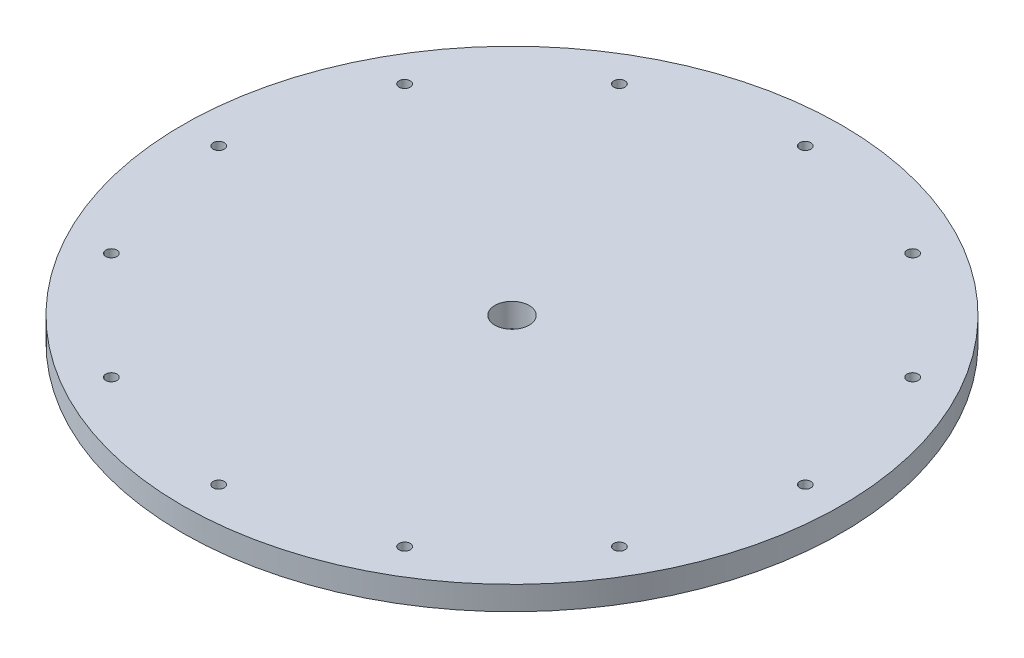
ISO-10303-21;
HEADER;
FILE_DESCRIPTION(('STEP AP214'),'2;1');
FILE_NAME('part.step','',(''),(''),'','','');
FILE_SCHEMA(('AUTOMOTIVE_DESIGN { 1 0 10303 214 1 1 1 1 }'));
ENDSEC;
DATA;
#1=APPLICATION_CONTEXT('core data for automotive mechanical design processes');
#2=APPLICATION_PROTOCOL_DEFINITION('international standard','automotive_design',2000,#1);
#3=PRODUCT_CONTEXT('',#1,'mechanical');
#4=PRODUCT('Part','Part','',(#3));
#5=PRODUCT_RELATED_PRODUCT_CATEGORY('part','',(#4));
#6=PRODUCT_DEFINITION_FORMATION('','',#4);
#7=PRODUCT_DEFINITION_CONTEXT('part definition',#1,'design');
#8=PRODUCT_DEFINITION('design','',#6,#7);
#9=PRODUCT_DEFINITION_SHAPE('','',#8);
#10=(LENGTH_UNIT() NAMED_UNIT(*) SI_UNIT(.MILLI.,.METRE.));
#11=(NAMED_UNIT(*) PLANE_ANGLE_UNIT() SI_UNIT($,.RADIAN.));
#12=(NAMED_UNIT(*) SI_UNIT($,.STERADIAN.) SOLID_ANGLE_UNIT());
#13=UNCERTAINTY_MEASURE_WITH_UNIT(LENGTH_MEASURE(1.E-05),#10,'distance_accuracy_value','');
#14=(GEOMETRIC_REPRESENTATION_CONTEXT(3) GLOBAL_UNCERTAINTY_ASSIGNED_CONTEXT((#13)) GLOBAL_UNIT_ASSIGNED_CONTEXT((#10,
#11,#12)) REPRESENTATION_CONTEXT('',''));
#15=CARTESIAN_POINT('',(0.,0.,0.));
#16=DIRECTION('',(0.,0.,1.));
#17=DIRECTION('',(1.,0.,0.));
#18=AXIS2_PLACEMENT_3D('',#15,#16,#17);
#19=CARTESIAN_POINT('',(0.,9.,0.));
#20=DIRECTION('',(0.,1.,0.));
#21=DIRECTION('',(0.,0.,1.));
#22=AXIS2_PLACEMENT_3D('',#19,#20,#21);
#23=PLANE('',#22);
#24=CARTESIAN_POINT('',(-192.690652342036,9.,-111.250000000002));
#25=DIRECTION('',(0.,1.,0.));
#26=DIRECTION('',(0.,0.,1.));
#27=AXIS2_PLACEMENT_3D('',#24,#25,#26);
#28=CIRCLE('',#27,4.25000000000001);
#29=CARTESIAN_POINT('',(-192.690652342036,9.,-107.000000000002));
#30=VERTEX_POINT('',#29);
#31=EDGE_CURVE('E107',#30,#30,#28,.T.);
#32=ORIENTED_EDGE('',*,*,#31,.F.);
#33=EDGE_LOOP('',(#32));
#34=FACE_BOUND('',#33,.T.);
#35=CARTESIAN_POINT('',(-192.690652342044,9.,111.249999999988));
#36=DIRECTION('',(0.,1.,0.));
#37=DIRECTION('',(0.,0.,1.));
#38=AXIS2_PLACEMENT_3D('',#35,#36,#37);
#39=CIRCLE('',#38,4.24999999998892);
#40=CARTESIAN_POINT('',(-192.690652342044,9.,115.499999999977));
#41=VERTEX_POINT('',#40);
#42=EDGE_CURVE('E95',#41,#41,#39,.T.);
#43=ORIENTED_EDGE('',*,*,#42,.F.);
#44=EDGE_LOOP('',(#43));
#45=FACE_BOUND('',#44,.T.);
#46=CARTESIAN_POINT('',(-1.37694744691727E-11,9.,222.499999999992));
#47=DIRECTION('',(0.,1.,0.));
#48=DIRECTION('',(0.,0.,1.));
#49=AXIS2_PLACEMENT_3D('',#46,#47,#48);
#50=CIRCLE('',#49,4.24999999999065);
#51=CARTESIAN_POINT('',(-1.37694744691727E-11,9.,226.749999999983));
#52=VERTEX_POINT('',#51);
#53=EDGE_CURVE('E83',#52,#52,#50,.T.);
#54=ORIENTED_EDGE('',*,*,#53,.F.);
#55=EDGE_LOOP('',(#54));
#56=FACE_BOUND('',#55,.T.);
#57=CARTESIAN_POINT('',(192.690652342024,9.,111.25));
#58=DIRECTION('',(0.,1.,0.));
#59=DIRECTION('',(0.,0.,1.));
#60=AXIS2_PLACEMENT_3D('',#57,#58,#59);
#61=CIRCLE('',#60,4.2500000000098);
#62=CARTESIAN_POINT('',(192.690652342024,9.,115.50000000001));
#63=VERTEX_POINT('',#62);
#64=EDGE_CURVE('E71',#63,#63,#61,.T.);
#65=ORIENTED_EDGE('',*,*,#64,.F.);
#66=EDGE_LOOP('',(#65));
#67=FACE_BOUND('',#66,.T.);
#68=CARTESIAN_POINT('',(192.690652342031,9.,-111.249999999996));
#69=DIRECTION('',(0.,1.,0.));
#70=DIRECTION('',(0.,0.,1.));
#71=AXIS2_PLACEMENT_3D('',#68,#69,#70);
#72=CIRCLE('',#71,4.25000000001649);
#73=CARTESIAN_POINT('',(192.690652342031,9.,-106.99999999998));
#74=VERTEX_POINT('',#73);
#75=EDGE_CURVE('E59',#74,#74,#72,.T.);
#76=ORIENTED_EDGE('',*,*,#75,.F.);
#77=EDGE_LOOP('',(#76));
#78=FACE_BOUND('',#77,.T.);
#79=CARTESIAN_POINT('',(0.,9.,-222.5));
#80=DIRECTION('',(0.,1.,0.));
#81=DIRECTION('',(0.,0.,1.));
#82=AXIS2_PLACEMENT_3D('',#79,#80,#81);
#83=CIRCLE('',#82,4.25);
#84=CARTESIAN_POINT('',(0.,9.,-218.25));
#85=VERTEX_POINT('',#84);
#86=EDGE_CURVE('E47',#85,#85,#83,.T.);
#87=ORIENTED_EDGE('',*,*,#86,.F.);
#88=EDGE_LOOP('',(#87));
#89=FACE_BOUND('',#88,.T.);
#90=CARTESIAN_POINT('',(0.,9.,0.));
#91=DIRECTION('',(0.,1.,0.));
#92=DIRECTION('',(0.,0.,1.));
#93=AXIS2_PLACEMENT_3D('',#90,#91,#92);
#94=CIRCLE('',#93,250.);
#95=CARTESIAN_POINT('',(0.,9.,250.));
#96=VERTEX_POINT('',#95);
#97=EDGE_CURVE('E10',#96,#96,#94,.T.);
#98=ORIENTED_EDGE('',*,*,#97,.T.);
#99=EDGE_LOOP('',(#98));
#100=FACE_BOUND('',#99,.T.);
#101=CARTESIAN_POINT('',(0.,9.,0.));
#102=DIRECTION('',(0.,1.,0.));
#103=DIRECTION('',(0.,0.,1.));
#104=AXIS2_PLACEMENT_3D('',#101,#102,#103);
#105=CIRCLE('',#104,13.);
#106=CARTESIAN_POINT('',(0.,9.,13.));
#107=VERTEX_POINT('',#106);
#108=EDGE_CURVE('E42',#107,#107,#105,.T.);
#109=ORIENTED_EDGE('',*,*,#108,.F.);
#110=EDGE_LOOP('',(#109));
#111=FACE_BOUND('',#110,.T.);
#112=CARTESIAN_POINT('',(111.249999999997,9.,-192.690652342035));
#113=DIRECTION('',(0.,1.,0.));
#114=DIRECTION('',(0.,0.,1.));
#115=AXIS2_PLACEMENT_3D('',#112,#113,#114);
#116=CIRCLE('',#115,4.25000000001413);
#117=CARTESIAN_POINT('',(111.249999999997,9.,-188.440652342021));
#118=VERTEX_POINT('',#117);
#119=EDGE_CURVE('E53',#118,#118,#116,.T.);
#120=ORIENTED_EDGE('',*,*,#119,.F.);
#121=EDGE_LOOP('',(#120));
#122=FACE_BOUND('',#121,.T.);
#123=CARTESIAN_POINT('',(222.499999999989,9.,2.91099780523512E-12));
#124=DIRECTION('',(0.,1.,0.));
#125=DIRECTION('',(0.,0.,1.));
#126=AXIS2_PLACEMENT_3D('',#123,#124,#125);
#127=CIRCLE('',#126,4.25000000002617);
#128=CARTESIAN_POINT('',(222.499999999989,9.,4.25000000002908));
#129=VERTEX_POINT('',#128);
#130=EDGE_CURVE('E65',#129,#129,#127,.T.);
#131=ORIENTED_EDGE('',*,*,#130,.F.);
#132=EDGE_LOOP('',(#131));
#133=FACE_BOUND('',#132,.T.);
#134=CARTESIAN_POINT('',(111.249999999985,9.,192.690652342034));
#135=DIRECTION('',(0.,1.,0.));
#136=DIRECTION('',(0.,0.,1.));
#137=AXIS2_PLACEMENT_3D('',#134,#135,#136);
#138=CIRCLE('',#137,4.2499999999886);
#139=CARTESIAN_POINT('',(111.249999999985,9.,196.940652342022));
#140=VERTEX_POINT('',#139);
#141=EDGE_CURVE('E77',#140,#140,#138,.T.);
#142=ORIENTED_EDGE('',*,*,#141,.F.);
#143=EDGE_LOOP('',(#142));
#144=FACE_BOUND('',#143,.T.);
#145=CARTESIAN_POINT('',(-111.250000000011,9.,192.690652342027));
#146=DIRECTION('',(0.,1.,0.));
#147=DIRECTION('',(0.,0.,1.));
#148=AXIS2_PLACEMENT_3D('',#145,#146,#147);
#149=CIRCLE('',#148,4.24999999998875);
#150=CARTESIAN_POINT('',(-111.250000000011,9.,196.940652342015));
#151=VERTEX_POINT('',#150);
#152=EDGE_CURVE('E89',#151,#151,#149,.T.);
#153=ORIENTED_EDGE('',*,*,#152,.F.);
#154=EDGE_LOOP('',(#153));
#155=FACE_BOUND('',#154,.T.);
#156=CARTESIAN_POINT('',(-222.500000000003,9.,-1.08399131859207E-11));
#157=DIRECTION('',(0.,1.,0.));
#158=DIRECTION('',(0.,0.,1.));
#159=AXIS2_PLACEMENT_3D('',#156,#157,#158);
#160=CIRCLE('',#159,4.24999999999101);
#161=CARTESIAN_POINT('',(-222.500000000003,9.,4.24999999998017));
#162=VERTEX_POINT('',#161);
#163=EDGE_CURVE('E101',#162,#162,#160,.T.);
#164=ORIENTED_EDGE('',*,*,#163,.F.);
#165=EDGE_LOOP('',(#164));
#166=FACE_BOUND('',#165,.T.);
#167=CARTESIAN_POINT('',(-111.249999999998,9.,-192.690652342039));
#168=DIRECTION('',(0.,1.,0.));
#169=DIRECTION('',(0.,0.,1.));
#170=AXIS2_PLACEMENT_3D('',#167,#168,#169);
#171=CIRCLE('',#170,4.25);
#172=CARTESIAN_POINT('',(-111.249999999998,9.,-188.440652342039));
#173=VERTEX_POINT('',#172);
#174=EDGE_CURVE('E113',#173,#173,#171,.T.);
#175=ORIENTED_EDGE('',*,*,#174,.F.);
#176=EDGE_LOOP('',(#175));
#177=FACE_BOUND('',#176,.T.);
#178=ADVANCED_FACE('F31',(#34,#45,#56,#67,#78,#89,#100,#111,#122,#133,#144,#155,#166,#177),#23,.T.);
#179=CARTESIAN_POINT('',(0.,-9.,0.));
#180=DIRECTION('',(0.,1.,0.));
#181=DIRECTION('',(0.,0.,1.));
#182=AXIS2_PLACEMENT_3D('',#179,#180,#181);
#183=PLANE('',#182);
#184=CARTESIAN_POINT('',(0.,-9.,0.));
#185=DIRECTION('',(0.,1.,0.));
#186=DIRECTION('',(0.,0.,1.));
#187=AXIS2_PLACEMENT_3D('',#184,#185,#186);
#188=CIRCLE('',#187,250.);
#189=CARTESIAN_POINT('',(0.,-9.,250.));
#190=VERTEX_POINT('',#189);
#191=EDGE_CURVE('E35',#190,#190,#188,.T.);
#192=ORIENTED_EDGE('',*,*,#191,.F.);
#193=EDGE_LOOP('',(#192));
#194=FACE_BOUND('',#193,.T.);
#195=CARTESIAN_POINT('',(0.,-9.,0.));
#196=DIRECTION('',(0.,1.,0.));
#197=DIRECTION('',(0.,0.,1.));
#198=AXIS2_PLACEMENT_3D('',#195,#196,#197);
#199=CIRCLE('',#198,13.);
#200=CARTESIAN_POINT('',(0.,-9.,13.));
#201=VERTEX_POINT('',#200);
#202=EDGE_CURVE('E44',#201,#201,#199,.T.);
#203=ORIENTED_EDGE('',*,*,#202,.T.);
#204=EDGE_LOOP('',(#203));
#205=FACE_BOUND('',#204,.T.);
#206=CARTESIAN_POINT('',(0.,-9.,-222.5));
#207=DIRECTION('',(0.,1.,0.));
#208=DIRECTION('',(0.,0.,1.));
#209=AXIS2_PLACEMENT_3D('',#206,#207,#208);
#210=CIRCLE('',#209,4.25);
#211=CARTESIAN_POINT('',(0.,-9.,-218.25));
#212=VERTEX_POINT('',#211);
#213=EDGE_CURVE('E50',#212,#212,#210,.T.);
#214=ORIENTED_EDGE('',*,*,#213,.T.);
#215=EDGE_LOOP('',(#214));
#216=FACE_BOUND('',#215,.T.);
#217=CARTESIAN_POINT('',(111.249999999997,-9.,-192.690652342035));
#218=DIRECTION('',(0.,1.,0.));
#219=DIRECTION('',(0.,0.,1.));
#220=AXIS2_PLACEMENT_3D('',#217,#218,#219);
#221=CIRCLE('',#220,4.25000000001413);
#222=CARTESIAN_POINT('',(111.249999999997,-9.,-188.440652342021));
#223=VERTEX_POINT('',#222);
#224=EDGE_CURVE('E56',#223,#223,#221,.T.);
#225=ORIENTED_EDGE('',*,*,#224,.T.);
#226=EDGE_LOOP('',(#225));
#227=FACE_BOUND('',#226,.T.);
#228=CARTESIAN_POINT('',(192.690652342031,-9.,-111.249999999996));
#229=DIRECTION('',(0.,1.,0.));
#230=DIRECTION('',(0.,0.,1.));
#231=AXIS2_PLACEMENT_3D('',#228,#229,#230);
#232=CIRCLE('',#231,4.25000000001649);
#233=CARTESIAN_POINT('',(192.690652342031,-9.,-106.99999999998));
#234=VERTEX_POINT('',#233);
#235=EDGE_CURVE('E62',#234,#234,#232,.T.);
#236=ORIENTED_EDGE('',*,*,#235,.T.);
#237=EDGE_LOOP('',(#236));
#238=FACE_BOUND('',#237,.T.);
#239=CARTESIAN_POINT('',(222.499999999989,-9.,2.91099780523512E-12));
#240=DIRECTION('',(0.,1.,0.));
#241=DIRECTION('',(0.,0.,1.));
#242=AXIS2_PLACEMENT_3D('',#239,#240,#241);
#243=CIRCLE('',#242,4.25000000002617);
#244=CARTESIAN_POINT('',(222.499999999989,-9.,4.25000000002908));
#245=VERTEX_POINT('',#244);
#246=EDGE_CURVE('E68',#245,#245,#243,.T.);
#247=ORIENTED_EDGE('',*,*,#246,.T.);
#248=EDGE_LOOP('',(#247));
#249=FACE_BOUND('',#248,.T.);
#250=CARTESIAN_POINT('',(192.690652342024,-9.,111.25));
#251=DIRECTION('',(0.,1.,0.));
#252=DIRECTION('',(0.,0.,1.));
#253=AXIS2_PLACEMENT_3D('',#250,#251,#252);
#254=CIRCLE('',#253,4.2500000000098);
#255=CARTESIAN_POINT('',(192.690652342024,-9.,115.50000000001));
#256=VERTEX_POINT('',#255);
#257=EDGE_CURVE('E74',#256,#256,#254,.T.);
#258=ORIENTED_EDGE('',*,*,#257,.T.);
#259=EDGE_LOOP('',(#258));
#260=FACE_BOUND('',#259,.T.);
#261=CARTESIAN_POINT('',(111.249999999985,-9.,192.690652342034));
#262=DIRECTION('',(0.,1.,0.));
#263=DIRECTION('',(0.,0.,1.));
#264=AXIS2_PLACEMENT_3D('',#261,#262,#263);
#265=CIRCLE('',#264,4.2499999999886);
#266=CARTESIAN_POINT('',(111.249999999985,-9.,196.940652342022));
#267=VERTEX_POINT('',#266);
#268=EDGE_CURVE('E80',#267,#267,#265,.T.);
#269=ORIENTED_EDGE('',*,*,#268,.T.);
#270=EDGE_LOOP('',(#269));
#271=FACE_BOUND('',#270,.T.);
#272=CARTESIAN_POINT('',(-1.37694744691727E-11,-9.,222.499999999992));
#273=DIRECTION('',(0.,1.,0.));
#274=DIRECTION('',(0.,0.,1.));
#275=AXIS2_PLACEMENT_3D('',#272,#273,#274);
#276=CIRCLE('',#275,4.24999999999065);
#277=CARTESIAN_POINT('',(-1.37694744691727E-11,-9.,226.749999999983));
#278=VERTEX_POINT('',#277);
#279=EDGE_CURVE('E86',#278,#278,#276,.T.);
#280=ORIENTED_EDGE('',*,*,#279,.T.);
#281=EDGE_LOOP('',(#280));
#282=FACE_BOUND('',#281,.T.);
#283=CARTESIAN_POINT('',(-111.250000000011,-9.,192.690652342027));
#284=DIRECTION('',(0.,1.,0.));
#285=DIRECTION('',(0.,0.,1.));
#286=AXIS2_PLACEMENT_3D('',#283,#284,#285);
#287=CIRCLE('',#286,4.24999999998875);
#288=CARTESIAN_POINT('',(-111.250000000011,-9.,196.940652342015));
#289=VERTEX_POINT('',#288);
#290=EDGE_CURVE('E92',#289,#289,#287,.T.);
#291=ORIENTED_EDGE('',*,*,#290,.T.);
#292=EDGE_LOOP('',(#291));
#293=FACE_BOUND('',#292,.T.);
#294=CARTESIAN_POINT('',(-192.690652342044,-9.,111.249999999988));
#295=DIRECTION('',(0.,1.,0.));
#296=DIRECTION('',(0.,0.,1.));
#297=AXIS2_PLACEMENT_3D('',#294,#295,#296);
#298=CIRCLE('',#297,4.24999999998892);
#299=CARTESIAN_POINT('',(-192.690652342044,-9.,115.499999999977));
#300=VERTEX_POINT('',#299);
#301=EDGE_CURVE('E98',#300,#300,#298,.T.);
#302=ORIENTED_EDGE('',*,*,#301,.T.);
#303=EDGE_LOOP('',(#302));
#304=FACE_BOUND('',#303,.T.);
#305=CARTESIAN_POINT('',(-222.500000000003,-9.,-1.08399131859207E-11));
#306=DIRECTION('',(0.,1.,0.));
#307=DIRECTION('',(0.,0.,1.));
#308=AXIS2_PLACEMENT_3D('',#305,#306,#307);
#309=CIRCLE('',#308,4.24999999999101);
#310=CARTESIAN_POINT('',(-222.500000000003,-9.,4.24999999998017));
#311=VERTEX_POINT('',#310);
#312=EDGE_CURVE('E104',#311,#311,#309,.T.);
#313=ORIENTED_EDGE('',*,*,#312,.T.);
#314=EDGE_LOOP('',(#313));
#315=FACE_BOUND('',#314,.T.);
#316=CARTESIAN_POINT('',(-192.690652342036,-9.,-111.250000000002));
#317=DIRECTION('',(0.,1.,0.));
#318=DIRECTION('',(0.,0.,1.));
#319=AXIS2_PLACEMENT_3D('',#316,#317,#318);
#320=CIRCLE('',#319,4.25000000000001);
#321=CARTESIAN_POINT('',(-192.690652342036,-9.,-107.000000000002));
#322=VERTEX_POINT('',#321);
#323=EDGE_CURVE('E110',#322,#322,#320,.T.);
#324=ORIENTED_EDGE('',*,*,#323,.T.);
#325=EDGE_LOOP('',(#324));
#326=FACE_BOUND('',#325,.T.);
#327=CARTESIAN_POINT('',(-111.249999999998,-9.,-192.690652342039));
#328=DIRECTION('',(0.,1.,0.));
#329=DIRECTION('',(0.,0.,1.));
#330=AXIS2_PLACEMENT_3D('',#327,#328,#329);
#331=CIRCLE('',#330,4.25);
#332=CARTESIAN_POINT('',(-111.249999999998,-9.,-188.440652342039));
#333=VERTEX_POINT('',#332);
#334=EDGE_CURVE('E116',#333,#333,#331,.T.);
#335=ORIENTED_EDGE('',*,*,#334,.T.);
#336=EDGE_LOOP('',(#335));
#337=FACE_BOUND('',#336,.T.);
#338=ADVANCED_FACE('F126',(#194,#205,#216,#227,#238,#249,#260,#271,#282,#293,#304,#315,#326,
#337),#183,.F.);
#339=CARTESIAN_POINT('',(0.,9.,0.));
#340=DIRECTION('',(0.,-1.,0.));
#341=DIRECTION('',(0.,0.,-1.));
#342=AXIS2_PLACEMENT_3D('',#339,#340,#341);
#343=CYLINDRICAL_SURFACE('',#342,250.);
#344=ORIENTED_EDGE('',*,*,#97,.F.);
#345=EDGE_LOOP('',(#344));
#346=FACE_BOUND('',#345,.T.);
#347=ORIENTED_EDGE('',*,*,#191,.T.);
#348=EDGE_LOOP('',(#347));
#349=FACE_BOUND('',#348,.T.);
#350=ADVANCED_FACE('F33',(#346,#349),#343,.T.);
#351=CARTESIAN_POINT('',(0.,9.,0.));
#352=DIRECTION('',(0.,-1.,0.));
#353=DIRECTION('',(0.,0.,-1.));
#354=AXIS2_PLACEMENT_3D('',#351,#352,#353);
#355=CYLINDRICAL_SURFACE('',#354,13.);
#356=ORIENTED_EDGE('',*,*,#108,.T.);
#357=EDGE_LOOP('',(#356));
#358=FACE_BOUND('',#357,.T.);
#359=ORIENTED_EDGE('',*,*,#202,.F.);
#360=EDGE_LOOP('',(#359));
#361=FACE_BOUND('',#360,.T.);
#362=ADVANCED_FACE('F136',(#358,#361),#355,.F.);
#363=CARTESIAN_POINT('',(0.,9.,-222.5));
#364=DIRECTION('',(0.,-1.,0.));
#365=DIRECTION('',(0.,0.,-1.));
#366=AXIS2_PLACEMENT_3D('',#363,#364,#365);
#367=CYLINDRICAL_SURFACE('',#366,4.25);
#368=ORIENTED_EDGE('',*,*,#86,.T.);
#369=EDGE_LOOP('',(#368));
#370=FACE_BOUND('',#369,.T.);
#371=ORIENTED_EDGE('',*,*,#213,.F.);
#372=EDGE_LOOP('',(#371));
#373=FACE_BOUND('',#372,.T.);
#374=ADVANCED_FACE('F139',(#370,#373),#367,.F.);
#375=CARTESIAN_POINT('',(111.249999999997,9.,-192.690652342035));
#376=DIRECTION('',(0.,-1.,0.));
#377=DIRECTION('',(0.,0.,-1.));
#378=AXIS2_PLACEMENT_3D('',#375,#376,#377);
#379=CYLINDRICAL_SURFACE('',#378,4.25000000001413);
#380=ORIENTED_EDGE('',*,*,#119,.T.);
#381=EDGE_LOOP('',(#380));
#382=FACE_BOUND('',#381,.T.);
#383=ORIENTED_EDGE('',*,*,#224,.F.);
#384=EDGE_LOOP('',(#383));
#385=FACE_BOUND('',#384,.T.);
#386=ADVANCED_FACE('F143',(#382,#385),#379,.F.);
#387=CARTESIAN_POINT('',(192.690652342031,9.,-111.249999999996));
#388=DIRECTION('',(0.,-1.,0.));
#389=DIRECTION('',(0.,0.,-1.));
#390=AXIS2_PLACEMENT_3D('',#387,#388,#389);
#391=CYLINDRICAL_SURFACE('',#390,4.25000000001649);
#392=ORIENTED_EDGE('',*,*,#75,.T.);
#393=EDGE_LOOP('',(#392));
#394=FACE_BOUND('',#393,.T.);
#395=ORIENTED_EDGE('',*,*,#235,.F.);
#396=EDGE_LOOP('',(#395));
#397=FACE_BOUND('',#396,.T.);
#398=ADVANCED_FACE('F147',(#394,#397),#391,.F.);
#399=CARTESIAN_POINT('',(222.499999999989,9.,2.91099780523512E-12));
#400=DIRECTION('',(0.,-1.,0.));
#401=DIRECTION('',(0.,0.,-1.));
#402=AXIS2_PLACEMENT_3D('',#399,#400,#401);
#403=CYLINDRICAL_SURFACE('',#402,4.25000000002617);
#404=ORIENTED_EDGE('',*,*,#130,.T.);
#405=EDGE_LOOP('',(#404));
#406=FACE_BOUND('',#405,.T.);
#407=ORIENTED_EDGE('',*,*,#246,.F.);
#408=EDGE_LOOP('',(#407));
#409=FACE_BOUND('',#408,.T.);
#410=ADVANCED_FACE('F151',(#406,#409),#403,.F.);
#411=CARTESIAN_POINT('',(192.690652342024,9.,111.25));
#412=DIRECTION('',(0.,-1.,0.));
#413=DIRECTION('',(0.,0.,-1.));
#414=AXIS2_PLACEMENT_3D('',#411,#412,#413);
#415=CYLINDRICAL_SURFACE('',#414,4.2500000000098);
#416=ORIENTED_EDGE('',*,*,#64,.T.);
#417=EDGE_LOOP('',(#416));
#418=FACE_BOUND('',#417,.T.);
#419=ORIENTED_EDGE('',*,*,#257,.F.);
#420=EDGE_LOOP('',(#419));
#421=FACE_BOUND('',#420,.T.);
#422=ADVANCED_FACE('F155',(#418,#421),#415,.F.);
#423=CARTESIAN_POINT('',(111.249999999985,9.,192.690652342034));
#424=DIRECTION('',(0.,-1.,0.));
#425=DIRECTION('',(0.,0.,-1.));
#426=AXIS2_PLACEMENT_3D('',#423,#424,#425);
#427=CYLINDRICAL_SURFACE('',#426,4.2499999999886);
#428=ORIENTED_EDGE('',*,*,#141,.T.);
#429=EDGE_LOOP('',(#428));
#430=FACE_BOUND('',#429,.T.);
#431=ORIENTED_EDGE('',*,*,#268,.F.);
#432=EDGE_LOOP('',(#431));
#433=FACE_BOUND('',#432,.T.);
#434=ADVANCED_FACE('F159',(#430,#433),#427,.F.);
#435=CARTESIAN_POINT('',(-1.37694744691727E-11,9.,222.499999999992));
#436=DIRECTION('',(0.,-1.,0.));
#437=DIRECTION('',(0.,0.,-1.));
#438=AXIS2_PLACEMENT_3D('',#435,#436,#437);
#439=CYLINDRICAL_SURFACE('',#438,4.24999999999065);
#440=ORIENTED_EDGE('',*,*,#53,.T.);
#441=EDGE_LOOP('',(#440));
#442=FACE_BOUND('',#441,.T.);
#443=ORIENTED_EDGE('',*,*,#279,.F.);
#444=EDGE_LOOP('',(#443));
#445=FACE_BOUND('',#444,.T.);
#446=ADVANCED_FACE('F163',(#442,#445),#439,.F.);
#447=CARTESIAN_POINT('',(-111.250000000011,9.,192.690652342027));
#448=DIRECTION('',(0.,-1.,0.));
#449=DIRECTION('',(0.,0.,-1.));
#450=AXIS2_PLACEMENT_3D('',#447,#448,#449);
#451=CYLINDRICAL_SURFACE('',#450,4.24999999998875);
#452=ORIENTED_EDGE('',*,*,#152,.T.);
#453=EDGE_LOOP('',(#452));
#454=FACE_BOUND('',#453,.T.);
#455=ORIENTED_EDGE('',*,*,#290,.F.);
#456=EDGE_LOOP('',(#455));
#457=FACE_BOUND('',#456,.T.);
#458=ADVANCED_FACE('F167',(#454,#457),#451,.F.);
#459=CARTESIAN_POINT('',(-192.690652342044,9.,111.249999999988));
#460=DIRECTION('',(0.,-1.,0.));
#461=DIRECTION('',(0.,0.,-1.));
#462=AXIS2_PLACEMENT_3D('',#459,#460,#461);
#463=CYLINDRICAL_SURFACE('',#462,4.24999999998892);
#464=ORIENTED_EDGE('',*,*,#42,.T.);
#465=EDGE_LOOP('',(#464));
#466=FACE_BOUND('',#465,.T.);
#467=ORIENTED_EDGE('',*,*,#301,.F.);
#468=EDGE_LOOP('',(#467));
#469=FACE_BOUND('',#468,.T.);
#470=ADVANCED_FACE('F171',(#466,#469),#463,.F.);
#471=CARTESIAN_POINT('',(-222.500000000003,9.,-1.08399131859207E-11));
#472=DIRECTION('',(0.,-1.,0.));
#473=DIRECTION('',(0.,0.,-1.));
#474=AXIS2_PLACEMENT_3D('',#471,#472,#473);
#475=CYLINDRICAL_SURFACE('',#474,4.24999999999101);
#476=ORIENTED_EDGE('',*,*,#163,.T.);
#477=EDGE_LOOP('',(#476));
#478=FACE_BOUND('',#477,.T.);
#479=ORIENTED_EDGE('',*,*,#312,.F.);
#480=EDGE_LOOP('',(#479));
#481=FACE_BOUND('',#480,.T.);
#482=ADVANCED_FACE('F175',(#478,#481),#475,.F.);
#483=CARTESIAN_POINT('',(-192.690652342036,9.,-111.250000000002));
#484=DIRECTION('',(0.,-1.,0.));
#485=DIRECTION('',(0.,0.,-1.));
#486=AXIS2_PLACEMENT_3D('',#483,#484,#485);
#487=CYLINDRICAL_SURFACE('',#486,4.25000000000001);
#488=ORIENTED_EDGE('',*,*,#31,.T.);
#489=EDGE_LOOP('',(#488));
#490=FACE_BOUND('',#489,.T.);
#491=ORIENTED_EDGE('',*,*,#323,.F.);
#492=EDGE_LOOP('',(#491));
#493=FACE_BOUND('',#492,.T.);
#494=ADVANCED_FACE('F179',(#490,#493),#487,.F.);
#495=CARTESIAN_POINT('',(-111.249999999998,9.,-192.690652342039));
#496=DIRECTION('',(0.,-1.,0.));
#497=DIRECTION('',(0.,0.,-1.));
#498=AXIS2_PLACEMENT_3D('',#495,#496,#497);
#499=CYLINDRICAL_SURFACE('',#498,4.25);
#500=ORIENTED_EDGE('',*,*,#174,.T.);
#501=EDGE_LOOP('',(#500));
#502=FACE_BOUND('',#501,.T.);
#503=ORIENTED_EDGE('',*,*,#334,.F.);
#504=EDGE_LOOP('',(#503));
#505=FACE_BOUND('',#504,.T.);
#506=ADVANCED_FACE('F122',(#502,#505),#499,.F.);
#507=CLOSED_SHELL('',(#178,#338,#350,#362,#374,#386,#398,#410,#422,#434,#446,#458,#470,#482,
#494,#506));
#508=MANIFOLD_SOLID_BREP('B2',#507);
#509=ADVANCED_BREP_SHAPE_REPRESENTATION('',(#18,#508),#14);
#510=SHAPE_DEFINITION_REPRESENTATION(#9,#509);
ENDSEC;
END-ISO-10303-21;
